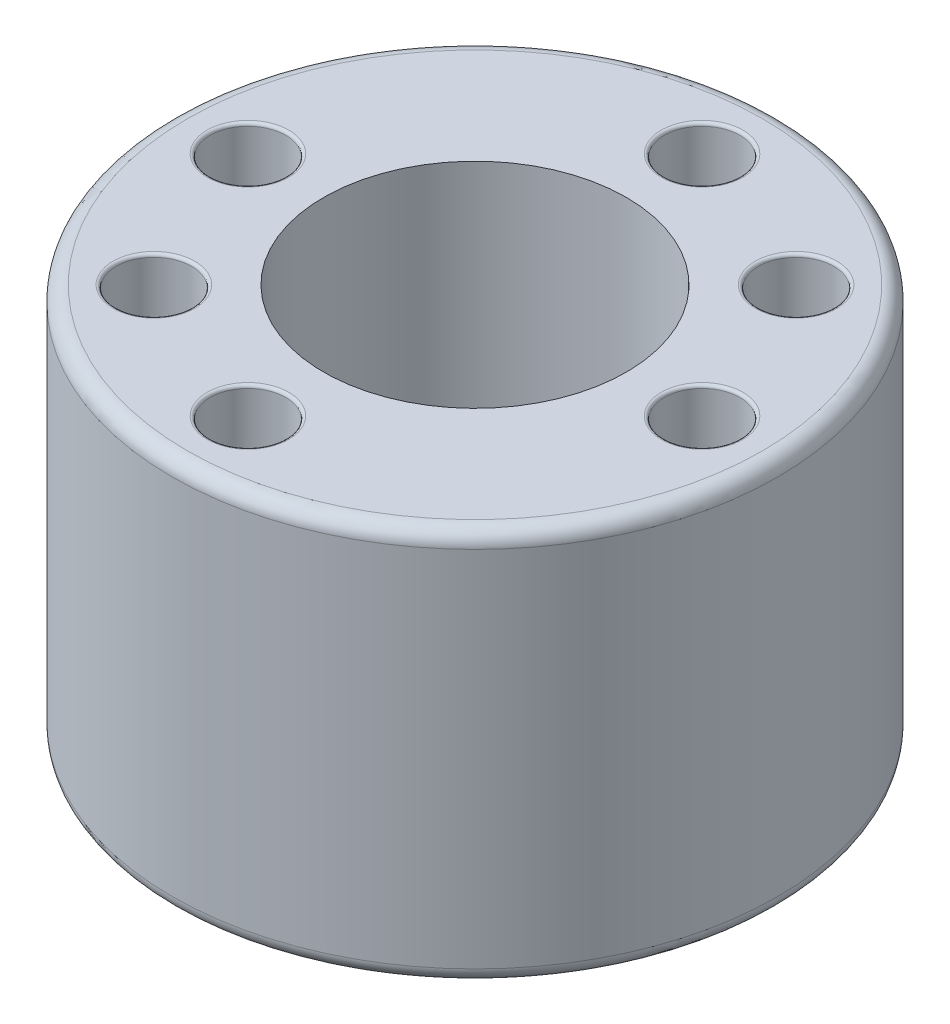
ISO-10303-21;
HEADER;
FILE_DESCRIPTION(('STEP AP214'),'2;1');
FILE_NAME('part.step','',(''),(''),'','','');
FILE_SCHEMA(('AUTOMOTIVE_DESIGN { 1 0 10303 214 1 1 1 1 }'));
ENDSEC;
DATA;
#1=APPLICATION_CONTEXT('core data for automotive mechanical design processes');
#2=APPLICATION_PROTOCOL_DEFINITION('international standard','automotive_design',2000,#1);
#3=PRODUCT_CONTEXT('',#1,'mechanical');
#4=PRODUCT('Part','Part','',(#3));
#5=PRODUCT_RELATED_PRODUCT_CATEGORY('part','',(#4));
#6=PRODUCT_DEFINITION_FORMATION('','',#4);
#7=PRODUCT_DEFINITION_CONTEXT('part definition',#1,'design');
#8=PRODUCT_DEFINITION('design','',#6,#7);
#9=PRODUCT_DEFINITION_SHAPE('','',#8);
#10=(LENGTH_UNIT() NAMED_UNIT(*) SI_UNIT(.MILLI.,.METRE.));
#11=(NAMED_UNIT(*) PLANE_ANGLE_UNIT() SI_UNIT($,.RADIAN.));
#12=(NAMED_UNIT(*) SI_UNIT($,.STERADIAN.) SOLID_ANGLE_UNIT());
#13=UNCERTAINTY_MEASURE_WITH_UNIT(LENGTH_MEASURE(1.E-05),#10,'distance_accuracy_value','');
#14=(GEOMETRIC_REPRESENTATION_CONTEXT(3) GLOBAL_UNCERTAINTY_ASSIGNED_CONTEXT((#13)) GLOBAL_UNIT_ASSIGNED_CONTEXT((#10,
#11,#12)) REPRESENTATION_CONTEXT('',''));
#15=CARTESIAN_POINT('',(0.,0.,0.));
#16=DIRECTION('',(0.,0.,1.));
#17=DIRECTION('',(1.,0.,0.));
#18=AXIS2_PLACEMENT_3D('',#15,#16,#17);
#19=CARTESIAN_POINT('',(0.,13.,0.));
#20=DIRECTION('',(0.,1.,0.));
#21=DIRECTION('',(0.,0.,1.));
#22=AXIS2_PLACEMENT_3D('',#19,#20,#21);
#23=PLANE('',#22);
#24=CARTESIAN_POINT('',(-5.30330085889911,13.,5.3033008588991));
#25=DIRECTION('',(0.,1.,0.));
#26=DIRECTION('',(0.,0.,1.));
#27=AXIS2_PLACEMENT_3D('',#24,#25,#26);
#28=CIRCLE('',#27,1.35);
#29=CARTESIAN_POINT('',(-5.30330085889911,13.,6.6533008588991));
#30=VERTEX_POINT('',#29);
#31=EDGE_CURVE('E68',#30,#30,#28,.F.);
#32=ORIENTED_EDGE('',*,*,#31,.T.);
#33=EDGE_LOOP('',(#32));
#34=FACE_BOUND('',#33,.T.);
#35=CARTESIAN_POINT('',(-7.5,13.,0.));
#36=DIRECTION('',(0.,1.,0.));
#37=DIRECTION('',(0.,0.,1.));
#38=AXIS2_PLACEMENT_3D('',#35,#36,#37);
#39=CIRCLE('',#38,1.35);
#40=CARTESIAN_POINT('',(-7.5,13.,1.34999999999992));
#41=VERTEX_POINT('',#40);
#42=EDGE_CURVE('E72',#41,#41,#39,.F.);
#43=ORIENTED_EDGE('',*,*,#42,.T.);
#44=EDGE_LOOP('',(#43));
#45=FACE_BOUND('',#44,.T.);
#46=CARTESIAN_POINT('',(0.,13.,7.5));
#47=DIRECTION('',(0.,1.,0.));
#48=DIRECTION('',(0.,0.,1.));
#49=AXIS2_PLACEMENT_3D('',#46,#47,#48);
#50=CIRCLE('',#49,1.35);
#51=CARTESIAN_POINT('',(0.,13.,8.85));
#52=VERTEX_POINT('',#51);
#53=EDGE_CURVE('E76',#52,#52,#50,.F.);
#54=ORIENTED_EDGE('',*,*,#53,.T.);
#55=EDGE_LOOP('',(#54));
#56=FACE_BOUND('',#55,.T.);
#57=CARTESIAN_POINT('',(7.5,13.,0.));
#58=DIRECTION('',(0.,1.,0.));
#59=DIRECTION('',(0.,0.,1.));
#60=AXIS2_PLACEMENT_3D('',#57,#58,#59);
#61=CIRCLE('',#60,1.35);
#62=CARTESIAN_POINT('',(7.5,13.,1.35000000000003));
#63=VERTEX_POINT('',#62);
#64=EDGE_CURVE('E80',#63,#63,#61,.F.);
#65=ORIENTED_EDGE('',*,*,#64,.T.);
#66=EDGE_LOOP('',(#65));
#67=FACE_BOUND('',#66,.T.);
#68=CARTESIAN_POINT('',(5.30330085889908,13.,-5.30330085889914));
#69=DIRECTION('',(0.,1.,0.));
#70=DIRECTION('',(0.,0.,1.));
#71=AXIS2_PLACEMENT_3D('',#68,#69,#70);
#72=CIRCLE('',#71,1.35);
#73=CARTESIAN_POINT('',(5.30330085889908,13.,-3.95330085889913));
#74=VERTEX_POINT('',#73);
#75=EDGE_CURVE('E84',#74,#74,#72,.F.);
#76=ORIENTED_EDGE('',*,*,#75,.T.);
#77=EDGE_LOOP('',(#76));
#78=FACE_BOUND('',#77,.T.);
#79=CARTESIAN_POINT('',(0.,13.,-7.5));
#80=DIRECTION('',(0.,1.,0.));
#81=DIRECTION('',(0.,0.,1.));
#82=AXIS2_PLACEMENT_3D('',#79,#80,#81);
#83=CIRCLE('',#82,1.35);
#84=CARTESIAN_POINT('',(0.,13.,-6.15));
#85=VERTEX_POINT('',#84);
#86=EDGE_CURVE('E88',#85,#85,#83,.F.);
#87=ORIENTED_EDGE('',*,*,#86,.T.);
#88=EDGE_LOOP('',(#87));
#89=FACE_BOUND('',#88,.T.);
#90=CARTESIAN_POINT('',(0.,13.,0.));
#91=DIRECTION('',(0.,1.,0.));
#92=DIRECTION('',(0.,0.,1.));
#93=AXIS2_PLACEMENT_3D('',#90,#91,#92);
#94=CIRCLE('',#93,9.5);
#95=CARTESIAN_POINT('',(0.,13.,9.5));
#96=VERTEX_POINT('',#95);
#97=EDGE_CURVE('E96',#96,#96,#94,.T.);
#98=ORIENTED_EDGE('',*,*,#97,.T.);
#99=EDGE_LOOP('',(#98));
#100=FACE_BOUND('',#99,.T.);
#101=CARTESIAN_POINT('',(0.,13.,0.));
#102=DIRECTION('',(0.,1.,0.));
#103=DIRECTION('',(0.,0.,1.));
#104=AXIS2_PLACEMENT_3D('',#101,#102,#103);
#105=CIRCLE('',#104,5.);
#106=CARTESIAN_POINT('',(0.,13.,-5.));
#107=VERTEX_POINT('',#106);
#108=EDGE_CURVE('E112',#107,#107,#105,.T.);
#109=ORIENTED_EDGE('',*,*,#108,.F.);
#110=EDGE_LOOP('',(#109));
#111=FACE_BOUND('',#110,.T.);
#112=ADVANCED_FACE('F40',(#34,#45,#56,#67,#78,#89,#100,#111),#23,.T.);
#113=CARTESIAN_POINT('',(0.,0.,0.));
#114=DIRECTION('',(0.,1.,0.));
#115=DIRECTION('',(0.,0.,1.));
#116=AXIS2_PLACEMENT_3D('',#113,#114,#115);
#117=PLANE('',#116);
#118=CARTESIAN_POINT('',(0.,0.,0.));
#119=DIRECTION('',(0.,1.,0.));
#120=DIRECTION('',(0.,0.,1.));
#121=AXIS2_PLACEMENT_3D('',#118,#119,#120);
#122=CIRCLE('',#121,9.5);
#123=CARTESIAN_POINT('',(0.,0.,9.5));
#124=VERTEX_POINT('',#123);
#125=EDGE_CURVE('E100',#124,#124,#122,.F.);
#126=ORIENTED_EDGE('',*,*,#125,.T.);
#127=EDGE_LOOP('',(#126));
#128=FACE_BOUND('',#127,.T.);
#129=CARTESIAN_POINT('',(0.,0.,0.));
#130=DIRECTION('',(0.,1.,0.));
#131=DIRECTION('',(0.,0.,1.));
#132=AXIS2_PLACEMENT_3D('',#129,#130,#131);
#133=CIRCLE('',#132,5.);
#134=CARTESIAN_POINT('',(0.,0.,-5.));
#135=VERTEX_POINT('',#134);
#136=EDGE_CURVE('E113',#135,#135,#133,.T.);
#137=ORIENTED_EDGE('',*,*,#136,.T.);
#138=EDGE_LOOP('',(#137));
#139=FACE_BOUND('',#138,.T.);
#140=ADVANCED_FACE('F164',(#128,#139),#117,.F.);
#141=CARTESIAN_POINT('',(0.,13.,0.));
#142=DIRECTION('',(0.,-1.,0.));
#143=DIRECTION('',(0.,0.,-1.));
#144=AXIS2_PLACEMENT_3D('',#141,#142,#143);
#145=CYLINDRICAL_SURFACE('',#144,10.);
#146=CARTESIAN_POINT('',(0.,0.5,0.));
#147=DIRECTION('',(0.,1.,0.));
#148=DIRECTION('',(0.,0.,1.));
#149=AXIS2_PLACEMENT_3D('',#146,#147,#148);
#150=CIRCLE('',#149,10.);
#151=CARTESIAN_POINT('',(0.,0.5,-10.));
#152=VERTEX_POINT('',#151);
#153=EDGE_CURVE('E104',#152,#152,#150,.T.);
#154=CARTESIAN_POINT('',(0.,12.5,0.));
#155=DIRECTION('',(0.,1.,0.));
#156=DIRECTION('',(0.,0.,1.));
#157=AXIS2_PLACEMENT_3D('',#154,#155,#156);
#158=CIRCLE('',#157,10.);
#159=CARTESIAN_POINT('',(0.,12.5,-10.));
#160=VERTEX_POINT('',#159);
#161=EDGE_CURVE('E108',#160,#160,#158,.F.);
#162=CARTESIAN_POINT('',(0.,0.5,-10.));
#163=CARTESIAN_POINT('',(0.,0.625000000000001,-10.));
#164=CARTESIAN_POINT('',(0.,0.750000000000001,-10.));
#165=CARTESIAN_POINT('',(0.,1.,-10.));
#166=CARTESIAN_POINT('',(0.,1.125,-10.));
#167=CARTESIAN_POINT('',(0.,1.375,-10.));
#168=CARTESIAN_POINT('',(0.,1.5,-10.));
#169=CARTESIAN_POINT('',(0.,1.75,-10.));
#170=CARTESIAN_POINT('',(0.,1.875,-10.));
#171=CARTESIAN_POINT('',(0.,2.125,-10.));
#172=CARTESIAN_POINT('',(0.,2.25,-10.));
#173=CARTESIAN_POINT('',(0.,2.5,-10.));
#174=CARTESIAN_POINT('',(0.,2.625,-10.));
#175=CARTESIAN_POINT('',(0.,2.875,-10.));
#176=CARTESIAN_POINT('',(0.,3.,-10.));
#177=CARTESIAN_POINT('',(0.,3.25,-10.));
#178=CARTESIAN_POINT('',(0.,3.375,-10.));
#179=CARTESIAN_POINT('',(0.,3.625,-10.));
#180=CARTESIAN_POINT('',(0.,3.75,-10.));
#181=CARTESIAN_POINT('',(0.,4.,-10.));
#182=CARTESIAN_POINT('',(0.,4.125,-10.));
#183=CARTESIAN_POINT('',(0.,4.375,-10.));
#184=CARTESIAN_POINT('',(0.,4.5,-10.));
#185=CARTESIAN_POINT('',(0.,4.75,-10.));
#186=CARTESIAN_POINT('',(0.,4.875,-10.));
#187=CARTESIAN_POINT('',(0.,5.125,-10.));
#188=CARTESIAN_POINT('',(0.,5.25,-10.));
#189=CARTESIAN_POINT('',(0.,5.5,-10.));
#190=CARTESIAN_POINT('',(0.,5.625,-10.));
#191=CARTESIAN_POINT('',(0.,5.875,-10.));
#192=CARTESIAN_POINT('',(0.,6.,-10.));
#193=CARTESIAN_POINT('',(0.,6.25,-10.));
#194=CARTESIAN_POINT('',(0.,6.375,-10.));
#195=CARTESIAN_POINT('',(0.,6.625,-10.));
#196=CARTESIAN_POINT('',(0.,6.75,-10.));
#197=CARTESIAN_POINT('',(0.,7.,-10.));
#198=CARTESIAN_POINT('',(0.,7.125,-10.));
#199=CARTESIAN_POINT('',(0.,7.375,-10.));
#200=CARTESIAN_POINT('',(0.,7.5,-10.));
#201=CARTESIAN_POINT('',(0.,7.75,-10.));
#202=CARTESIAN_POINT('',(0.,7.875,-10.));
#203=CARTESIAN_POINT('',(0.,8.125,-10.));
#204=CARTESIAN_POINT('',(0.,8.25,-10.));
#205=CARTESIAN_POINT('',(0.,8.5,-10.));
#206=CARTESIAN_POINT('',(0.,8.625,-10.));
#207=CARTESIAN_POINT('',(0.,8.875,-10.));
#208=CARTESIAN_POINT('',(0.,9.,-10.));
#209=CARTESIAN_POINT('',(0.,9.25,-10.));
#210=CARTESIAN_POINT('',(0.,9.375,-10.));
#211=CARTESIAN_POINT('',(0.,9.625,-10.));
#212=CARTESIAN_POINT('',(0.,9.75,-10.));
#213=CARTESIAN_POINT('',(0.,10.,-10.));
#214=CARTESIAN_POINT('',(0.,10.125,-10.));
#215=CARTESIAN_POINT('',(0.,10.375,-10.));
#216=CARTESIAN_POINT('',(0.,10.5,-10.));
#217=CARTESIAN_POINT('',(0.,10.75,-10.));
#218=CARTESIAN_POINT('',(0.,10.875,-10.));
#219=CARTESIAN_POINT('',(0.,11.125,-10.));
#220=CARTESIAN_POINT('',(0.,11.25,-10.));
#221=CARTESIAN_POINT('',(0.,11.5,-10.));
#222=CARTESIAN_POINT('',(0.,11.625,-10.));
#223=CARTESIAN_POINT('',(0.,11.875,-10.));
#224=CARTESIAN_POINT('',(0.,12.,-10.));
#225=CARTESIAN_POINT('',(0.,12.25,-10.));
#226=CARTESIAN_POINT('',(0.,12.375,-10.));
#227=CARTESIAN_POINT('',(0.,12.5,-10.));
#228=B_SPLINE_CURVE_WITH_KNOTS('',3,(#162,#163,#164,#165,#166,#167,#168,#169,#170,#171,#172,
#173,#174,#175,#176,#177,#178,#179,#180,#181,#182,#183,#184,#185,#186,#187,#188,#189,#190,#191,
#192,#193,#194,#195,#196,#197,#198,#199,#200,#201,#202,#203,#204,#205,#206,#207,#208,#209,#210,
#211,#212,#213,#214,#215,#216,#217,#218,#219,#220,#221,#222,#223,#224,#225,#226,#227),
.UNSPECIFIED.,.F.,.F.,(4,2,2,2,2,2,2,2,2,2,2,2,2,2,2,2,2,2,2,2,2,2,2,2,2,2,2,2,2,2,2,2,4),(0.,
0.375,0.750000000000001,1.125,1.5,1.875,2.25,2.625,3.,3.375,3.75,4.125,4.5,4.875,5.25,5.625,6.,
6.375,6.75,7.125,7.5,7.875,8.25,8.625,9.,9.375,9.75,10.125,10.5,10.875,11.25,11.625,12.),.UNSPECIFIED.);
#229=EDGE_CURVE('BSEAM171',#152,#160,#228,.T.);
#230=ORIENTED_EDGE('',*,*,#153,.T.);
#231=ORIENTED_EDGE('',*,*,#161,.T.);
#232=ORIENTED_EDGE('',*,*,#229,.T.);
#233=ORIENTED_EDGE('',*,*,#229,.F.);
#234=EDGE_LOOP('',(#230,#232,#231,#233));
#235=FACE_BOUND('',#234,.T.);
#236=ADVANCED_FACE('F171',(#235),#145,.T.);
#237=CARTESIAN_POINT('',(0.,13.,0.));
#238=DIRECTION('',(0.,-1.,0.));
#239=DIRECTION('',(0.,0.,-1.));
#240=AXIS2_PLACEMENT_3D('',#237,#238,#239);
#241=CYLINDRICAL_SURFACE('',#240,5.);
#242=CARTESIAN_POINT('',(0.,13.,-5.));
#243=CARTESIAN_POINT('',(0.,12.8645833333333,-5.));
#244=CARTESIAN_POINT('',(0.,12.7291666666667,-5.));
#245=CARTESIAN_POINT('',(0.,12.4583333333333,-5.));
#246=CARTESIAN_POINT('',(0.,12.3229166666667,-5.));
#247=CARTESIAN_POINT('',(0.,12.0520833333333,-5.));
#248=CARTESIAN_POINT('',(0.,11.9166666666667,-5.));
#249=CARTESIAN_POINT('',(0.,11.6458333333333,-5.));
#250=CARTESIAN_POINT('',(0.,11.5104166666667,-5.));
#251=CARTESIAN_POINT('',(0.,11.2395833333333,-5.));
#252=CARTESIAN_POINT('',(0.,11.1041666666667,-5.));
#253=CARTESIAN_POINT('',(0.,10.8333333333333,-5.));
#254=CARTESIAN_POINT('',(0.,10.6979166666667,-5.));
#255=CARTESIAN_POINT('',(0.,10.4270833333333,-5.));
#256=CARTESIAN_POINT('',(0.,10.2916666666667,-5.));
#257=CARTESIAN_POINT('',(0.,10.0208333333333,-5.));
#258=CARTESIAN_POINT('',(0.,9.88541666666667,-5.));
#259=CARTESIAN_POINT('',(0.,9.61458333333333,-5.));
#260=CARTESIAN_POINT('',(0.,9.47916666666667,-5.));
#261=CARTESIAN_POINT('',(0.,9.20833333333333,-5.));
#262=CARTESIAN_POINT('',(0.,9.07291666666667,-5.));
#263=CARTESIAN_POINT('',(0.,8.80208333333333,-5.));
#264=CARTESIAN_POINT('',(0.,8.66666666666667,-5.));
#265=CARTESIAN_POINT('',(0.,8.39583333333333,-5.));
#266=CARTESIAN_POINT('',(0.,8.26041666666667,-5.));
#267=CARTESIAN_POINT('',(0.,7.98958333333333,-5.));
#268=CARTESIAN_POINT('',(0.,7.85416666666667,-5.));
#269=CARTESIAN_POINT('',(0.,7.58333333333333,-5.));
#270=CARTESIAN_POINT('',(0.,7.44791666666667,-5.));
#271=CARTESIAN_POINT('',(0.,7.17708333333333,-5.));
#272=CARTESIAN_POINT('',(0.,7.04166666666667,-5.));
#273=CARTESIAN_POINT('',(0.,6.77083333333333,-5.));
#274=CARTESIAN_POINT('',(0.,6.63541666666667,-5.));
#275=CARTESIAN_POINT('',(0.,6.36458333333333,-5.));
#276=CARTESIAN_POINT('',(0.,6.22916666666667,-5.));
#277=CARTESIAN_POINT('',(0.,5.95833333333333,-5.));
#278=CARTESIAN_POINT('',(0.,5.82291666666667,-5.));
#279=CARTESIAN_POINT('',(0.,5.55208333333333,-5.));
#280=CARTESIAN_POINT('',(0.,5.41666666666667,-5.));
#281=CARTESIAN_POINT('',(0.,5.14583333333333,-5.));
#282=CARTESIAN_POINT('',(0.,5.01041666666667,-5.));
#283=CARTESIAN_POINT('',(0.,4.73958333333333,-5.));
#284=CARTESIAN_POINT('',(0.,4.60416666666667,-5.));
#285=CARTESIAN_POINT('',(0.,4.33333333333333,-5.));
#286=CARTESIAN_POINT('',(0.,4.19791666666667,-5.));
#287=CARTESIAN_POINT('',(0.,3.92708333333333,-5.));
#288=CARTESIAN_POINT('',(0.,3.79166666666667,-5.));
#289=CARTESIAN_POINT('',(0.,3.52083333333333,-5.));
#290=CARTESIAN_POINT('',(0.,3.38541666666667,-5.));
#291=CARTESIAN_POINT('',(0.,3.11458333333333,-5.));
#292=CARTESIAN_POINT('',(0.,2.97916666666667,-5.));
#293=CARTESIAN_POINT('',(0.,2.70833333333333,-5.));
#294=CARTESIAN_POINT('',(0.,2.57291666666667,-5.));
#295=CARTESIAN_POINT('',(0.,2.30208333333333,-5.));
#296=CARTESIAN_POINT('',(0.,2.16666666666667,-5.));
#297=CARTESIAN_POINT('',(0.,1.89583333333333,-5.));
#298=CARTESIAN_POINT('',(0.,1.76041666666667,-5.));
#299=CARTESIAN_POINT('',(0.,1.48958333333333,-5.));
#300=CARTESIAN_POINT('',(0.,1.35416666666667,-5.));
#301=CARTESIAN_POINT('',(0.,1.08333333333333,-5.));
#302=CARTESIAN_POINT('',(0.,0.947916666666667,-5.));
#303=CARTESIAN_POINT('',(0.,0.677083333333334,-5.));
#304=CARTESIAN_POINT('',(0.,0.541666666666667,-5.));
#305=CARTESIAN_POINT('',(0.,0.270833333333334,-5.));
#306=CARTESIAN_POINT('',(0.,0.135416666666667,-5.));
#307=CARTESIAN_POINT('',(0.,0.,-5.));
#308=B_SPLINE_CURVE_WITH_KNOTS('',3,(#242,#243,#244,#245,#246,#247,#248,#249,#250,#251,#252,
#253,#254,#255,#256,#257,#258,#259,#260,#261,#262,#263,#264,#265,#266,#267,#268,#269,#270,#271,
#272,#273,#274,#275,#276,#277,#278,#279,#280,#281,#282,#283,#284,#285,#286,#287,#288,#289,#290,
#291,#292,#293,#294,#295,#296,#297,#298,#299,#300,#301,#302,#303,#304,#305,#306,#307),
.UNSPECIFIED.,.F.,.F.,(4,2,2,2,2,2,2,2,2,2,2,2,2,2,2,2,2,2,2,2,2,2,2,2,2,2,2,2,2,2,2,2,4),(0.,
0.406249999999999,0.812499999999999,1.21875,1.625,2.03125,2.4375,2.84375,3.25,3.65625,4.0625,
4.46875,4.875,5.28125,5.6875,6.09375,6.5,6.90625,7.3125,7.71875,8.125,8.53125,8.9375,9.34375,
9.75,10.15625,10.5625,10.96875,11.375,11.78125,12.1875,12.59375,13.),.UNSPECIFIED.);
#309=EDGE_CURVE('BSEAM176',#107,#135,#308,.T.);
#310=ORIENTED_EDGE('',*,*,#108,.T.);
#311=ORIENTED_EDGE('',*,*,#136,.F.);
#312=ORIENTED_EDGE('',*,*,#309,.T.);
#313=ORIENTED_EDGE('',*,*,#309,.F.);
#314=EDGE_LOOP('',(#310,#312,#311,#313));
#315=FACE_BOUND('',#314,.T.);
#316=ADVANCED_FACE('F176',(#315),#241,.F.);
#317=CARTESIAN_POINT('',(0.,0.999999999999999,-7.5));
#318=DIRECTION('',(0.,1.,0.));
#319=DIRECTION('',(0.,0.,1.));
#320=AXIS2_PLACEMENT_3D('',#317,#318,#319);
#321=CYLINDRICAL_SURFACE('',#320,1.25);
#322=CARTESIAN_POINT('',(0.,12.9,-7.5));
#323=DIRECTION('',(0.,1.,0.));
#324=DIRECTION('',(0.,0.,1.));
#325=AXIS2_PLACEMENT_3D('',#322,#323,#324);
#326=CIRCLE('',#325,1.25);
#327=CARTESIAN_POINT('',(0.,12.9,-6.25));
#328=VERTEX_POINT('',#327);
#329=EDGE_CURVE('E10',#328,#328,#326,.T.);
#330=ORIENTED_EDGE('',*,*,#329,.T.);
#331=EDGE_LOOP('',(#330));
#332=FACE_BOUND('',#331,.T.);
#333=CARTESIAN_POINT('',(0.,0.999999999999999,-7.5));
#334=DIRECTION('',(0.,1.,0.));
#335=DIRECTION('',(0.,0.,1.));
#336=AXIS2_PLACEMENT_3D('',#333,#334,#335);
#337=CIRCLE('',#336,1.25);
#338=CARTESIAN_POINT('',(0.,0.999999999999999,-6.25));
#339=VERTEX_POINT('',#338);
#340=EDGE_CURVE('E117',#339,#339,#337,.T.);
#341=ORIENTED_EDGE('',*,*,#340,.F.);
#342=EDGE_LOOP('',(#341));
#343=FACE_BOUND('',#342,.T.);
#344=ADVANCED_FACE('F160',(#332,#343),#321,.F.);
#345=CARTESIAN_POINT('',(0.,0.999999999999999,-7.5));
#346=DIRECTION('',(0.,1.,0.));
#347=DIRECTION('',(0.,0.,1.));
#348=AXIS2_PLACEMENT_3D('',#345,#346,#347);
#349=PLANE('',#348);
#350=ORIENTED_EDGE('',*,*,#340,.T.);
#351=EDGE_LOOP('',(#350));
#352=FACE_BOUND('',#351,.T.);
#353=ADVANCED_FACE('F149',(#352),#349,.T.);
#354=CARTESIAN_POINT('',(-5.30330085889911,0.999999999999999,5.3033008588991));
#355=DIRECTION('',(0.,1.,0.));
#356=DIRECTION('',(0.,0.,1.));
#357=AXIS2_PLACEMENT_3D('',#354,#355,#356);
#358=CYLINDRICAL_SURFACE('',#357,1.25);
#359=CARTESIAN_POINT('',(-5.30330085889911,12.9,5.3033008588991));
#360=DIRECTION('',(0.,1.,0.));
#361=DIRECTION('',(0.,0.,1.));
#362=AXIS2_PLACEMENT_3D('',#359,#360,#361);
#363=CIRCLE('',#362,1.25);
#364=CARTESIAN_POINT('',(-5.30330085889911,12.9,6.5533008588991));
#365=VERTEX_POINT('',#364);
#366=EDGE_CURVE('E92',#365,#365,#363,.T.);
#367=ORIENTED_EDGE('',*,*,#366,.T.);
#368=EDGE_LOOP('',(#367));
#369=FACE_BOUND('',#368,.T.);
#370=CARTESIAN_POINT('',(-5.30330085889911,0.999999999999999,5.3033008588991));
#371=DIRECTION('',(0.,1.,0.));
#372=DIRECTION('',(0.,0.,-1.));
#373=AXIS2_PLACEMENT_3D('',#370,#371,#372);
#374=CIRCLE('',#373,1.25);
#375=CARTESIAN_POINT('',(-5.30330085889911,0.999999999999999,4.0533008588991));
#376=VERTEX_POINT('',#375);
#377=EDGE_CURVE('E137',#376,#376,#374,.T.);
#378=ORIENTED_EDGE('',*,*,#377,.F.);
#379=EDGE_LOOP('',(#378));
#380=FACE_BOUND('',#379,.T.);
#381=ADVANCED_FACE('F147',(#369,#380),#358,.F.);
#382=CARTESIAN_POINT('',(-5.30330085889911,0.999999999999999,5.3033008588991));
#383=DIRECTION('',(0.,-1.,0.));
#384=DIRECTION('',(0.,0.,-1.));
#385=AXIS2_PLACEMENT_3D('',#382,#383,#384);
#386=PLANE('',#385);
#387=ORIENTED_EDGE('',*,*,#377,.T.);
#388=EDGE_LOOP('',(#387));
#389=FACE_BOUND('',#388,.T.);
#390=ADVANCED_FACE('F145',(#389),#386,.F.);
#391=CARTESIAN_POINT('',(7.5,0.999999999999999,0.));
#392=DIRECTION('',(0.,1.,0.));
#393=DIRECTION('',(0.,0.,1.));
#394=AXIS2_PLACEMENT_3D('',#391,#392,#393);
#395=CYLINDRICAL_SURFACE('',#394,1.25);
#396=CARTESIAN_POINT('',(7.5,12.9,0.));
#397=DIRECTION('',(0.,1.,0.));
#398=DIRECTION('',(0.,0.,1.));
#399=AXIS2_PLACEMENT_3D('',#396,#397,#398);
#400=CIRCLE('',#399,1.25);
#401=CARTESIAN_POINT('',(7.5,12.9,1.25000000000003));
#402=VERTEX_POINT('',#401);
#403=EDGE_CURVE('E53',#402,#402,#400,.T.);
#404=ORIENTED_EDGE('',*,*,#403,.T.);
#405=EDGE_LOOP('',(#404));
#406=FACE_BOUND('',#405,.T.);
#407=CARTESIAN_POINT('',(7.5,0.999999999999999,0.));
#408=DIRECTION('',(0.,1.,0.));
#409=DIRECTION('',(0.,0.,1.));
#410=AXIS2_PLACEMENT_3D('',#407,#408,#409);
#411=CIRCLE('',#410,1.25);
#412=CARTESIAN_POINT('',(7.5,0.999999999999999,1.25000000000003));
#413=VERTEX_POINT('',#412);
#414=EDGE_CURVE('E124',#413,#413,#411,.T.);
#415=ORIENTED_EDGE('',*,*,#414,.F.);
#416=EDGE_LOOP('',(#415));
#417=FACE_BOUND('',#416,.T.);
#418=ADVANCED_FACE('F157',(#406,#417),#395,.F.);
#419=CARTESIAN_POINT('',(7.5,0.999999999999999,0.));
#420=DIRECTION('',(0.,1.,0.));
#421=DIRECTION('',(0.,0.,1.));
#422=AXIS2_PLACEMENT_3D('',#419,#420,#421);
#423=PLANE('',#422);
#424=ORIENTED_EDGE('',*,*,#414,.T.);
#425=EDGE_LOOP('',(#424));
#426=FACE_BOUND('',#425,.T.);
#427=ADVANCED_FACE('F242',(#426),#423,.T.);
#428=CARTESIAN_POINT('',(0.,0.999999999999999,7.5));
#429=DIRECTION('',(0.,1.,0.));
#430=DIRECTION('',(0.,0.,1.));
#431=AXIS2_PLACEMENT_3D('',#428,#429,#430);
#432=CYLINDRICAL_SURFACE('',#431,1.25);
#433=CARTESIAN_POINT('',(0.,12.9,7.5));
#434=DIRECTION('',(0.,1.,0.));
#435=DIRECTION('',(0.,0.,1.));
#436=AXIS2_PLACEMENT_3D('',#433,#434,#435);
#437=CIRCLE('',#436,1.25);
#438=CARTESIAN_POINT('',(0.,12.9,8.75));
#439=VERTEX_POINT('',#438);
#440=EDGE_CURVE('E58',#439,#439,#437,.T.);
#441=ORIENTED_EDGE('',*,*,#440,.T.);
#442=EDGE_LOOP('',(#441));
#443=FACE_BOUND('',#442,.T.);
#444=CARTESIAN_POINT('',(0.,0.999999999999999,7.5));
#445=DIRECTION('',(0.,1.,0.));
#446=DIRECTION('',(0.,0.,1.));
#447=AXIS2_PLACEMENT_3D('',#444,#445,#446);
#448=CIRCLE('',#447,1.25);
#449=CARTESIAN_POINT('',(0.,0.999999999999999,8.75));
#450=VERTEX_POINT('',#449);
#451=EDGE_CURVE('E125',#450,#450,#448,.T.);
#452=ORIENTED_EDGE('',*,*,#451,.F.);
#453=EDGE_LOOP('',(#452));
#454=FACE_BOUND('',#453,.T.);
#455=ADVANCED_FACE('F238',(#443,#454),#432,.F.);
#456=CARTESIAN_POINT('',(0.,0.999999999999999,7.5));
#457=DIRECTION('',(0.,1.,0.));
#458=DIRECTION('',(0.,0.,1.));
#459=AXIS2_PLACEMENT_3D('',#456,#457,#458);
#460=PLANE('',#459);
#461=ORIENTED_EDGE('',*,*,#451,.T.);
#462=EDGE_LOOP('',(#461));
#463=FACE_BOUND('',#462,.T.);
#464=ADVANCED_FACE('F234',(#463),#460,.T.);
#465=CARTESIAN_POINT('',(-7.5,0.999999999999999,0.));
#466=DIRECTION('',(0.,1.,0.));
#467=DIRECTION('',(0.,0.,1.));
#468=AXIS2_PLACEMENT_3D('',#465,#466,#467);
#469=CYLINDRICAL_SURFACE('',#468,1.25);
#470=CARTESIAN_POINT('',(-7.5,12.9,0.));
#471=DIRECTION('',(0.,1.,0.));
#472=DIRECTION('',(0.,0.,1.));
#473=AXIS2_PLACEMENT_3D('',#470,#471,#472);
#474=CIRCLE('',#473,1.25);
#475=CARTESIAN_POINT('',(-7.5,12.9,1.24999999999992));
#476=VERTEX_POINT('',#475);
#477=EDGE_CURVE('E64',#476,#476,#474,.T.);
#478=ORIENTED_EDGE('',*,*,#477,.T.);
#479=EDGE_LOOP('',(#478));
#480=FACE_BOUND('',#479,.T.);
#481=CARTESIAN_POINT('',(-7.5,0.999999999999999,0.));
#482=DIRECTION('',(0.,1.,0.));
#483=DIRECTION('',(0.,0.,1.));
#484=AXIS2_PLACEMENT_3D('',#481,#482,#483);
#485=CIRCLE('',#484,1.25);
#486=CARTESIAN_POINT('',(-7.5,0.999999999999999,1.24999999999992));
#487=VERTEX_POINT('',#486);
#488=EDGE_CURVE('E129',#487,#487,#485,.T.);
#489=ORIENTED_EDGE('',*,*,#488,.F.);
#490=EDGE_LOOP('',(#489));
#491=FACE_BOUND('',#490,.T.);
#492=ADVANCED_FACE('F237',(#480,#491),#469,.F.);
#493=CARTESIAN_POINT('',(-7.5,0.999999999999999,0.));
#494=DIRECTION('',(0.,1.,0.));
#495=DIRECTION('',(0.,0.,1.));
#496=AXIS2_PLACEMENT_3D('',#493,#494,#495);
#497=PLANE('',#496);
#498=ORIENTED_EDGE('',*,*,#488,.T.);
#499=EDGE_LOOP('',(#498));
#500=FACE_BOUND('',#499,.T.);
#501=ADVANCED_FACE('F255',(#500),#497,.T.);
#502=CARTESIAN_POINT('',(5.30330085889908,0.999999999999999,-5.30330085889914));
#503=DIRECTION('',(0.,1.,0.));
#504=DIRECTION('',(0.,0.,1.));
#505=AXIS2_PLACEMENT_3D('',#502,#503,#504);
#506=CYLINDRICAL_SURFACE('',#505,1.25);
#507=CARTESIAN_POINT('',(5.30330085889908,12.9,-5.30330085889914));
#508=DIRECTION('',(0.,1.,0.));
#509=DIRECTION('',(0.,0.,1.));
#510=AXIS2_PLACEMENT_3D('',#507,#508,#509);
#511=CIRCLE('',#510,1.25);
#512=CARTESIAN_POINT('',(5.30330085889908,12.9,-4.05330085889914));
#513=VERTEX_POINT('',#512);
#514=EDGE_CURVE('E48',#513,#513,#511,.T.);
#515=ORIENTED_EDGE('',*,*,#514,.T.);
#516=EDGE_LOOP('',(#515));
#517=FACE_BOUND('',#516,.T.);
#518=CARTESIAN_POINT('',(5.30330085889908,0.999999999999999,-5.30330085889914));
#519=DIRECTION('',(0.,1.,0.));
#520=DIRECTION('',(0.,0.,1.));
#521=AXIS2_PLACEMENT_3D('',#518,#519,#520);
#522=CIRCLE('',#521,1.25);
#523=CARTESIAN_POINT('',(5.30330085889908,0.999999999999999,-4.05330085889914));
#524=VERTEX_POINT('',#523);
#525=EDGE_CURVE('E133',#524,#524,#522,.T.);
#526=ORIENTED_EDGE('',*,*,#525,.F.);
#527=EDGE_LOOP('',(#526));
#528=FACE_BOUND('',#527,.T.);
#529=ADVANCED_FACE('F251',(#517,#528),#506,.F.);
#530=CARTESIAN_POINT('',(5.30330085889908,0.999999999999999,-5.30330085889914));
#531=DIRECTION('',(0.,1.,0.));
#532=DIRECTION('',(0.,0.,1.));
#533=AXIS2_PLACEMENT_3D('',#530,#531,#532);
#534=PLANE('',#533);
#535=ORIENTED_EDGE('',*,*,#525,.T.);
#536=EDGE_LOOP('',(#535));
#537=FACE_BOUND('',#536,.T.);
#538=ADVANCED_FACE('F186',(#537),#534,.T.);
#539=CARTESIAN_POINT('',(0.,0.5,0.));
#540=DIRECTION('',(0.,1.,0.));
#541=DIRECTION('',(0.,0.,1.));
#542=AXIS2_PLACEMENT_3D('',#539,#540,#541);
#543=TOROIDAL_SURFACE('',#542,9.5,0.5);
#544=ORIENTED_EDGE('',*,*,#125,.F.);
#545=EDGE_LOOP('',(#544));
#546=FACE_BOUND('',#545,.T.);
#547=ORIENTED_EDGE('',*,*,#153,.F.);
#548=EDGE_LOOP('',(#547));
#549=FACE_BOUND('',#548,.T.);
#550=ADVANCED_FACE('F182',(#546,#549),#543,.T.);
#551=CARTESIAN_POINT('',(0.,12.5,0.));
#552=DIRECTION('',(0.,1.,0.));
#553=DIRECTION('',(0.,0.,1.));
#554=AXIS2_PLACEMENT_3D('',#551,#552,#553);
#555=TOROIDAL_SURFACE('',#554,9.5,0.5);
#556=ORIENTED_EDGE('',*,*,#161,.F.);
#557=EDGE_LOOP('',(#556));
#558=FACE_BOUND('',#557,.T.);
#559=ORIENTED_EDGE('',*,*,#97,.F.);
#560=EDGE_LOOP('',(#559));
#561=FACE_BOUND('',#560,.T.);
#562=ADVANCED_FACE('F185',(#558,#561),#555,.T.);
#563=CARTESIAN_POINT('',(-5.30330085889911,12.9,5.3033008588991));
#564=DIRECTION('',(0.,1.,0.));
#565=DIRECTION('',(0.,0.,1.));
#566=AXIS2_PLACEMENT_3D('',#563,#564,#565);
#567=TOROIDAL_SURFACE('',#566,1.35,0.1);
#568=ORIENTED_EDGE('',*,*,#31,.F.);
#569=EDGE_LOOP('',(#568));
#570=FACE_BOUND('',#569,.T.);
#571=ORIENTED_EDGE('',*,*,#366,.F.);
#572=EDGE_LOOP('',(#571));
#573=FACE_BOUND('',#572,.T.);
#574=ADVANCED_FACE('F190',(#570,#573),#567,.T.);
#575=CARTESIAN_POINT('',(-7.5,12.9,0.));
#576=DIRECTION('',(0.,1.,0.));
#577=DIRECTION('',(0.,0.,1.));
#578=AXIS2_PLACEMENT_3D('',#575,#576,#577);
#579=TOROIDAL_SURFACE('',#578,1.35,0.1);
#580=ORIENTED_EDGE('',*,*,#42,.F.);
#581=EDGE_LOOP('',(#580));
#582=FACE_BOUND('',#581,.T.);
#583=ORIENTED_EDGE('',*,*,#477,.F.);
#584=EDGE_LOOP('',(#583));
#585=FACE_BOUND('',#584,.T.);
#586=ADVANCED_FACE('F194',(#582,#585),#579,.T.);
#587=CARTESIAN_POINT('',(0.,12.9,7.5));
#588=DIRECTION('',(0.,1.,0.));
#589=DIRECTION('',(0.,0.,1.));
#590=AXIS2_PLACEMENT_3D('',#587,#588,#589);
#591=TOROIDAL_SURFACE('',#590,1.35,0.1);
#592=ORIENTED_EDGE('',*,*,#53,.F.);
#593=EDGE_LOOP('',(#592));
#594=FACE_BOUND('',#593,.T.);
#595=ORIENTED_EDGE('',*,*,#440,.F.);
#596=EDGE_LOOP('',(#595));
#597=FACE_BOUND('',#596,.T.);
#598=ADVANCED_FACE('F198',(#594,#597),#591,.T.);
#599=CARTESIAN_POINT('',(7.5,12.9,0.));
#600=DIRECTION('',(0.,1.,0.));
#601=DIRECTION('',(0.,0.,1.));
#602=AXIS2_PLACEMENT_3D('',#599,#600,#601);
#603=TOROIDAL_SURFACE('',#602,1.35,0.1);
#604=ORIENTED_EDGE('',*,*,#64,.F.);
#605=EDGE_LOOP('',(#604));
#606=FACE_BOUND('',#605,.T.);
#607=ORIENTED_EDGE('',*,*,#403,.F.);
#608=EDGE_LOOP('',(#607));
#609=FACE_BOUND('',#608,.T.);
#610=ADVANCED_FACE('F202',(#606,#609),#603,.T.);
#611=CARTESIAN_POINT('',(5.30330085889908,12.9,-5.30330085889914));
#612=DIRECTION('',(0.,1.,0.));
#613=DIRECTION('',(0.,0.,1.));
#614=AXIS2_PLACEMENT_3D('',#611,#612,#613);
#615=TOROIDAL_SURFACE('',#614,1.35,0.1);
#616=ORIENTED_EDGE('',*,*,#75,.F.);
#617=EDGE_LOOP('',(#616));
#618=FACE_BOUND('',#617,.T.);
#619=ORIENTED_EDGE('',*,*,#514,.F.);
#620=EDGE_LOOP('',(#619));
#621=FACE_BOUND('',#620,.T.);
#622=ADVANCED_FACE('F205',(#618,#621),#615,.T.);
#623=CARTESIAN_POINT('',(0.,12.9,-7.5));
#624=DIRECTION('',(0.,1.,0.));
#625=DIRECTION('',(0.,0.,1.));
#626=AXIS2_PLACEMENT_3D('',#623,#624,#625);
#627=TOROIDAL_SURFACE('',#626,1.35,0.1);
#628=ORIENTED_EDGE('',*,*,#86,.F.);
#629=EDGE_LOOP('',(#628));
#630=FACE_BOUND('',#629,.T.);
#631=ORIENTED_EDGE('',*,*,#329,.F.);
#632=EDGE_LOOP('',(#631));
#633=FACE_BOUND('',#632,.T.);
#634=ADVANCED_FACE('F42',(#630,#633),#627,.T.);
#635=CLOSED_SHELL('',(#112,#140,#236,#316,#344,#353,#381,#390,#418,#427,#455,#464,#492,#501,
#529,#538,#550,#562,#574,#586,#598,#610,#622,#634));
#636=MANIFOLD_SOLID_BREP('B2',#635);
#637=ADVANCED_BREP_SHAPE_REPRESENTATION('',(#18,#636),#14);
#638=SHAPE_DEFINITION_REPRESENTATION(#9,#637);
ENDSEC;
END-ISO-10303-21;
